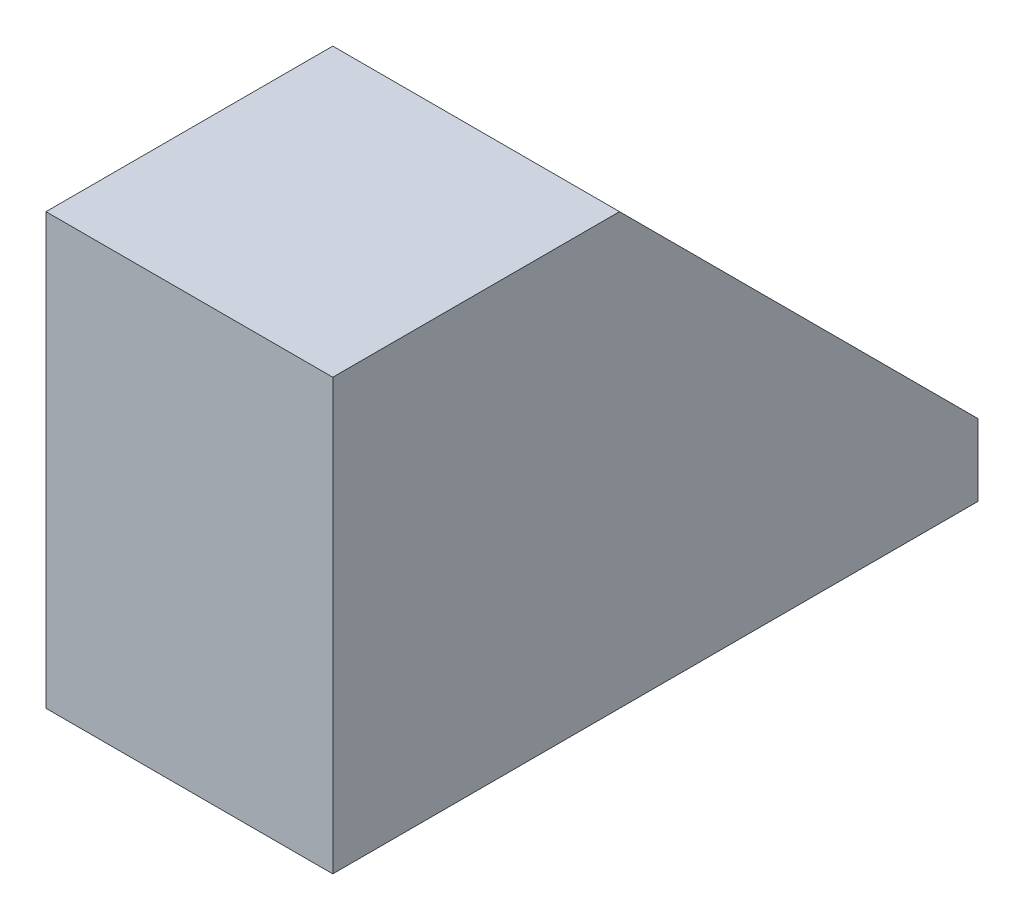
ISO-10303-21;
HEADER;
FILE_DESCRIPTION(('STEP AP214'),'2;1');
FILE_NAME('part.step','',(''),(''),'','','');
FILE_SCHEMA(('AUTOMOTIVE_DESIGN { 1 0 10303 214 1 1 1 1 }'));
ENDSEC;
DATA;
#1=APPLICATION_CONTEXT('core data for automotive mechanical design processes');
#2=APPLICATION_PROTOCOL_DEFINITION('international standard','automotive_design',2000,#1);
#3=PRODUCT_CONTEXT('',#1,'mechanical');
#4=PRODUCT('Part','Part','',(#3));
#5=PRODUCT_RELATED_PRODUCT_CATEGORY('part','',(#4));
#6=PRODUCT_DEFINITION_FORMATION('','',#4);
#7=PRODUCT_DEFINITION_CONTEXT('part definition',#1,'design');
#8=PRODUCT_DEFINITION('design','',#6,#7);
#9=PRODUCT_DEFINITION_SHAPE('','',#8);
#10=(LENGTH_UNIT() NAMED_UNIT(*) SI_UNIT(.MILLI.,.METRE.));
#11=(NAMED_UNIT(*) PLANE_ANGLE_UNIT() SI_UNIT($,.RADIAN.));
#12=(NAMED_UNIT(*) SI_UNIT($,.STERADIAN.) SOLID_ANGLE_UNIT());
#13=UNCERTAINTY_MEASURE_WITH_UNIT(LENGTH_MEASURE(1.E-05),#10,'distance_accuracy_value','');
#14=(GEOMETRIC_REPRESENTATION_CONTEXT(3) GLOBAL_UNCERTAINTY_ASSIGNED_CONTEXT((#13)) GLOBAL_UNIT_ASSIGNED_CONTEXT((#10,
#11,#12)) REPRESENTATION_CONTEXT('',''));
#15=CARTESIAN_POINT('',(0.,0.,0.));
#16=DIRECTION('',(0.,0.,1.));
#17=DIRECTION('',(1.,0.,0.));
#18=AXIS2_PLACEMENT_3D('',#15,#16,#17);
#19=CARTESIAN_POINT('',(40.,-30.,45.));
#20=DIRECTION('',(0.,0.,-1.));
#21=DIRECTION('',(-1.,0.,0.));
#22=AXIS2_PLACEMENT_3D('',#19,#20,#21);
#23=PLANE('',#22);
#24=DIRECTION('',(0.,-1.,0.));
#25=VECTOR('',#24,1.);
#26=CARTESIAN_POINT('',(0.,-30.,45.));
#27=LINE('',#26,#25);
#28=CARTESIAN_POINT('',(0.,30.,45.));
#29=VERTEX_POINT('',#28);
#30=CARTESIAN_POINT('',(0.,-30.,45.));
#31=VERTEX_POINT('',#30);
#32=EDGE_CURVE('E118',#29,#31,#27,.T.);
#33=ORIENTED_EDGE('',*,*,#32,.T.);
#34=DIRECTION('',(-1.,0.,0.));
#35=VECTOR('',#34,1.);
#36=CARTESIAN_POINT('',(40.,-30.,45.));
#37=LINE('',#36,#35);
#38=CARTESIAN_POINT('',(40.,-30.,45.));
#39=VERTEX_POINT('',#38);
#40=EDGE_CURVE('E11',#39,#31,#37,.T.);
#41=ORIENTED_EDGE('',*,*,#40,.F.);
#42=DIRECTION('',(0.,-1.,0.));
#43=VECTOR('',#42,1.);
#44=CARTESIAN_POINT('',(40.,-30.,45.));
#45=LINE('',#44,#43);
#46=CARTESIAN_POINT('',(40.,30.,45.));
#47=VERTEX_POINT('',#46);
#48=EDGE_CURVE('E131',#47,#39,#45,.T.);
#49=ORIENTED_EDGE('',*,*,#48,.F.);
#50=DIRECTION('',(-1.,0.,0.));
#51=VECTOR('',#50,1.);
#52=CARTESIAN_POINT('',(40.,30.,45.));
#53=LINE('',#52,#51);
#54=EDGE_CURVE('E114',#47,#29,#53,.T.);
#55=ORIENTED_EDGE('',*,*,#54,.T.);
#56=EDGE_LOOP('',(#33,#41,#49,#55));
#57=FACE_BOUND('',#56,.T.);
#58=ADVANCED_FACE('F39',(#57),#23,.F.);
#59=CARTESIAN_POINT('',(40.,-30.,45.));
#60=DIRECTION('',(0.,1.,0.));
#61=DIRECTION('',(0.,0.,1.));
#62=AXIS2_PLACEMENT_3D('',#59,#60,#61);
#63=PLANE('',#62);
#64=DIRECTION('',(0.,0.,-1.));
#65=VECTOR('',#64,1.);
#66=CARTESIAN_POINT('',(0.,-30.,45.));
#67=LINE('',#66,#65);
#68=CARTESIAN_POINT('',(0.,-30.,-45.));
#69=VERTEX_POINT('',#68);
#70=EDGE_CURVE('E122',#31,#69,#67,.T.);
#71=ORIENTED_EDGE('',*,*,#70,.T.);
#72=DIRECTION('',(-1.,0.,0.));
#73=VECTOR('',#72,1.);
#74=CARTESIAN_POINT('',(40.,-30.,-45.));
#75=LINE('',#74,#73);
#76=CARTESIAN_POINT('',(40.,-30.,-45.));
#77=VERTEX_POINT('',#76);
#78=EDGE_CURVE('E48',#77,#69,#75,.T.);
#79=ORIENTED_EDGE('',*,*,#78,.F.);
#80=DIRECTION('',(0.,0.,-1.));
#81=VECTOR('',#80,1.);
#82=CARTESIAN_POINT('',(40.,-30.,45.));
#83=LINE('',#82,#81);
#84=EDGE_CURVE('E90',#39,#77,#83,.T.);
#85=ORIENTED_EDGE('',*,*,#84,.F.);
#86=ORIENTED_EDGE('',*,*,#40,.T.);
#87=EDGE_LOOP('',(#71,#79,#85,#86));
#88=FACE_BOUND('',#87,.T.);
#89=ADVANCED_FACE('F153',(#88),#63,.F.);
#90=CARTESIAN_POINT('',(40.,-30.,-45.));
#91=DIRECTION('',(0.,0.,1.));
#92=DIRECTION('',(1.,0.,0.));
#93=AXIS2_PLACEMENT_3D('',#90,#91,#92);
#94=PLANE('',#93);
#95=DIRECTION('',(0.,1.,0.));
#96=VECTOR('',#95,1.);
#97=CARTESIAN_POINT('',(0.,-30.,-45.));
#98=LINE('',#97,#96);
#99=CARTESIAN_POINT('',(0.,-20.,-45.));
#100=VERTEX_POINT('',#99);
#101=EDGE_CURVE('E106',#69,#100,#98,.T.);
#102=ORIENTED_EDGE('',*,*,#101,.T.);
#103=DIRECTION('',(-1.,0.,0.));
#104=VECTOR('',#103,1.);
#105=CARTESIAN_POINT('',(40.,-20.,-45.));
#106=LINE('',#105,#104);
#107=CARTESIAN_POINT('',(40.,-20.,-45.));
#108=VERTEX_POINT('',#107);
#109=EDGE_CURVE('E103',#108,#100,#106,.T.);
#110=ORIENTED_EDGE('',*,*,#109,.F.);
#111=DIRECTION('',(0.,1.,0.));
#112=VECTOR('',#111,1.);
#113=CARTESIAN_POINT('',(40.,-30.,-45.));
#114=LINE('',#113,#112);
#115=EDGE_CURVE('E94',#77,#108,#114,.T.);
#116=ORIENTED_EDGE('',*,*,#115,.F.);
#117=ORIENTED_EDGE('',*,*,#78,.T.);
#118=EDGE_LOOP('',(#102,#110,#116,#117));
#119=FACE_BOUND('',#118,.T.);
#120=ADVANCED_FACE('F104',(#119),#94,.F.);
#121=CARTESIAN_POINT('',(40.,30.,5.));
#122=DIRECTION('',(0.,-0.707106781186548,0.707106781186548));
#123=DIRECTION('',(0.,-0.707106781186548,-0.707106781186548));
#124=AXIS2_PLACEMENT_3D('',#121,#122,#123);
#125=PLANE('',#124);
#126=DIRECTION('',(0.,0.707106781186547,0.707106781186547));
#127=VECTOR('',#126,1.);
#128=CARTESIAN_POINT('',(0.,30.,5.));
#129=LINE('',#128,#127);
#130=CARTESIAN_POINT('',(0.,30.,5.));
#131=VERTEX_POINT('',#130);
#132=EDGE_CURVE('E76',#100,#131,#129,.T.);
#133=ORIENTED_EDGE('',*,*,#132,.T.);
#134=DIRECTION('',(-1.,0.,0.));
#135=VECTOR('',#134,1.);
#136=CARTESIAN_POINT('',(40.,30.,5.));
#137=LINE('',#136,#135);
#138=CARTESIAN_POINT('',(40.,30.,5.));
#139=VERTEX_POINT('',#138);
#140=EDGE_CURVE('E108',#139,#131,#137,.T.);
#141=ORIENTED_EDGE('',*,*,#140,.F.);
#142=DIRECTION('',(0.,0.707106781186547,0.707106781186547));
#143=VECTOR('',#142,1.);
#144=CARTESIAN_POINT('',(40.,30.,5.));
#145=LINE('',#144,#143);
#146=EDGE_CURVE('E98',#108,#139,#145,.T.);
#147=ORIENTED_EDGE('',*,*,#146,.F.);
#148=ORIENTED_EDGE('',*,*,#109,.T.);
#149=EDGE_LOOP('',(#133,#141,#147,#148));
#150=FACE_BOUND('',#149,.T.);
#151=ADVANCED_FACE('F110',(#150),#125,.F.);
#152=CARTESIAN_POINT('',(40.,30.,45.));
#153=DIRECTION('',(0.,-1.,0.));
#154=DIRECTION('',(0.,0.,-1.));
#155=AXIS2_PLACEMENT_3D('',#152,#153,#154);
#156=PLANE('',#155);
#157=DIRECTION('',(0.,0.,1.));
#158=VECTOR('',#157,1.);
#159=CARTESIAN_POINT('',(0.,30.,45.));
#160=LINE('',#159,#158);
#161=EDGE_CURVE('E82',#131,#29,#160,.T.);
#162=ORIENTED_EDGE('',*,*,#161,.T.);
#163=ORIENTED_EDGE('',*,*,#54,.F.);
#164=DIRECTION('',(0.,0.,1.));
#165=VECTOR('',#164,1.);
#166=CARTESIAN_POINT('',(40.,30.,45.));
#167=LINE('',#166,#165);
#168=EDGE_CURVE('E56',#139,#47,#167,.T.);
#169=ORIENTED_EDGE('',*,*,#168,.F.);
#170=ORIENTED_EDGE('',*,*,#140,.T.);
#171=EDGE_LOOP('',(#162,#163,#169,#170));
#172=FACE_BOUND('',#171,.T.);
#173=ADVANCED_FACE('F142',(#172),#156,.F.);
#174=CARTESIAN_POINT('',(40.,0.,0.));
#175=DIRECTION('',(-1.,0.,0.));
#176=DIRECTION('',(0.,0.,1.));
#177=AXIS2_PLACEMENT_3D('',#174,#175,#176);
#178=PLANE('',#177);
#179=ORIENTED_EDGE('',*,*,#48,.T.);
#180=ORIENTED_EDGE('',*,*,#84,.T.);
#181=ORIENTED_EDGE('',*,*,#115,.T.);
#182=ORIENTED_EDGE('',*,*,#146,.T.);
#183=ORIENTED_EDGE('',*,*,#168,.T.);
#184=EDGE_LOOP('',(#179,#180,#181,#182,#183));
#185=FACE_BOUND('',#184,.T.);
#186=ADVANCED_FACE('F96',(#185),#178,.F.);
#187=CARTESIAN_POINT('',(0.,0.,0.));
#188=DIRECTION('',(-1.,0.,0.));
#189=DIRECTION('',(0.,0.,1.));
#190=AXIS2_PLACEMENT_3D('',#187,#188,#189);
#191=PLANE('',#190);
#192=ORIENTED_EDGE('',*,*,#32,.F.);
#193=ORIENTED_EDGE('',*,*,#161,.F.);
#194=ORIENTED_EDGE('',*,*,#132,.F.);
#195=ORIENTED_EDGE('',*,*,#101,.F.);
#196=ORIENTED_EDGE('',*,*,#70,.F.);
#197=EDGE_LOOP('',(#192,#193,#194,#195,#196));
#198=FACE_BOUND('',#197,.T.);
#199=ADVANCED_FACE('F138',(#198),#191,.T.);
#200=CLOSED_SHELL('',(#58,#89,#120,#151,#173,#186,#199));
#201=MANIFOLD_SOLID_BREP('B2',#200);
#202=ADVANCED_BREP_SHAPE_REPRESENTATION('',(#18,#201),#14);
#203=SHAPE_DEFINITION_REPRESENTATION(#9,#202);
ENDSEC;
END-ISO-10303-21;
